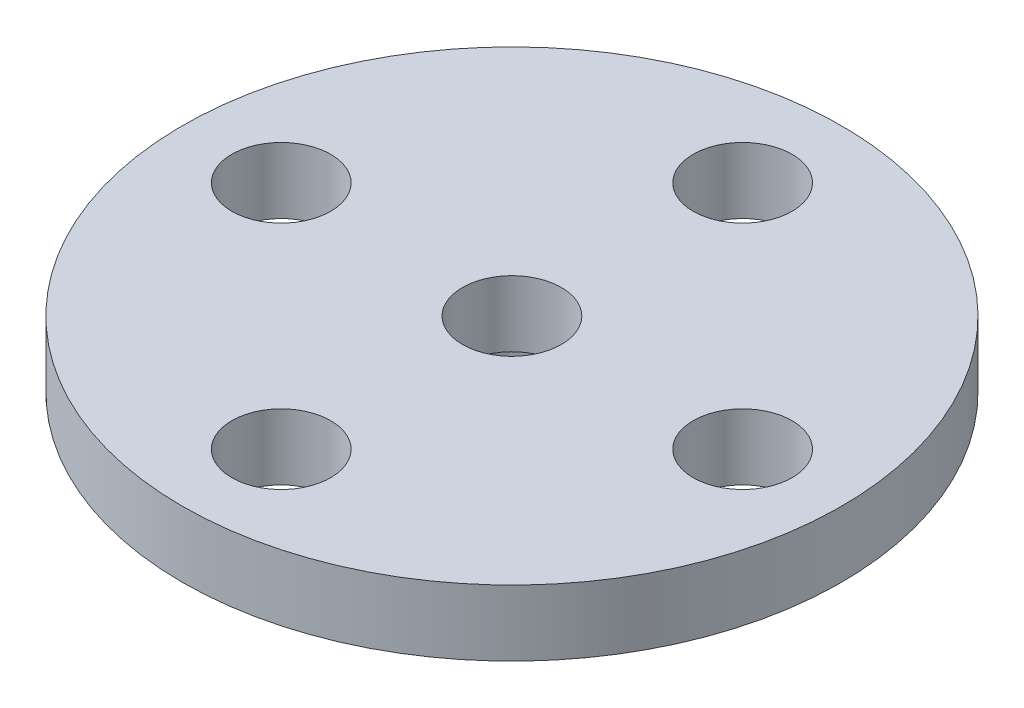
ISO-10303-21;
HEADER;
FILE_DESCRIPTION(('STEP AP214'),'2;1');
FILE_NAME('part.step','',(''),(''),'','','');
FILE_SCHEMA(('AUTOMOTIVE_DESIGN { 1 0 10303 214 1 1 1 1 }'));
ENDSEC;
DATA;
#1=APPLICATION_CONTEXT('core data for automotive mechanical design processes');
#2=APPLICATION_PROTOCOL_DEFINITION('international standard','automotive_design',2000,#1);
#3=PRODUCT_CONTEXT('',#1,'mechanical');
#4=PRODUCT('Part','Part','',(#3));
#5=PRODUCT_RELATED_PRODUCT_CATEGORY('part','',(#4));
#6=PRODUCT_DEFINITION_FORMATION('','',#4);
#7=PRODUCT_DEFINITION_CONTEXT('part definition',#1,'design');
#8=PRODUCT_DEFINITION('design','',#6,#7);
#9=PRODUCT_DEFINITION_SHAPE('','',#8);
#10=(LENGTH_UNIT() NAMED_UNIT(*) SI_UNIT(.MILLI.,.METRE.));
#11=(NAMED_UNIT(*) PLANE_ANGLE_UNIT() SI_UNIT($,.RADIAN.));
#12=(NAMED_UNIT(*) SI_UNIT($,.STERADIAN.) SOLID_ANGLE_UNIT());
#13=UNCERTAINTY_MEASURE_WITH_UNIT(LENGTH_MEASURE(1.E-05),#10,'distance_accuracy_value','');
#14=(GEOMETRIC_REPRESENTATION_CONTEXT(3) GLOBAL_UNCERTAINTY_ASSIGNED_CONTEXT((#13)) GLOBAL_UNIT_ASSIGNED_CONTEXT((#10,
#11,#12)) REPRESENTATION_CONTEXT('',''));
#15=CARTESIAN_POINT('',(0.,0.,0.));
#16=DIRECTION('',(0.,0.,1.));
#17=DIRECTION('',(1.,0.,0.));
#18=AXIS2_PLACEMENT_3D('',#15,#16,#17);
#19=CARTESIAN_POINT('',(0.,0.,0.));
#20=DIRECTION('',(0.,1.,0.));
#21=DIRECTION('',(0.,0.,1.));
#22=AXIS2_PLACEMENT_3D('',#19,#20,#21);
#23=PLANE('',#22);
#24=CARTESIAN_POINT('',(0.,0.,0.));
#25=DIRECTION('',(0.,1.,0.));
#26=DIRECTION('',(0.,0.,1.));
#27=AXIS2_PLACEMENT_3D('',#24,#25,#26);
#28=CIRCLE('',#27,1.5);
#29=CARTESIAN_POINT('',(0.,0.,1.5));
#30=VERTEX_POINT('',#29);
#31=EDGE_CURVE('E59',#30,#30,#28,.T.);
#32=ORIENTED_EDGE('',*,*,#31,.T.);
#33=EDGE_LOOP('',(#32));
#34=FACE_BOUND('',#33,.T.);
#35=CARTESIAN_POINT('',(0.,0.,0.));
#36=DIRECTION('',(0.,-1.,0.));
#37=DIRECTION('',(0.,0.,-1.));
#38=AXIS2_PLACEMENT_3D('',#35,#36,#37);
#39=CIRCLE('',#38,2.07281324157104);
#40=CARTESIAN_POINT('',(0.,0.,-2.07281324157104));
#41=VERTEX_POINT('',#40);
#42=EDGE_CURVE('E86',#41,#41,#39,.T.);
#43=ORIENTED_EDGE('',*,*,#42,.T.);
#44=EDGE_LOOP('',(#43));
#45=FACE_BOUND('',#44,.T.);
#46=ADVANCED_FACE('F35',(#34,#45),#23,.F.);
#47=CARTESIAN_POINT('',(0.,2.,0.));
#48=DIRECTION('',(0.,1.,0.));
#49=DIRECTION('',(0.,0.,1.));
#50=AXIS2_PLACEMENT_3D('',#47,#48,#49);
#51=PLANE('',#50);
#52=CARTESIAN_POINT('',(4.58037733640242E-13,2.,7.));
#53=DIRECTION('',(0.,1.,0.));
#54=DIRECTION('',(0.,0.,1.));
#55=AXIS2_PLACEMENT_3D('',#52,#53,#54);
#56=CIRCLE('',#55,1.5);
#57=CARTESIAN_POINT('',(4.58037733640242E-13,2.,8.5));
#58=VERTEX_POINT('',#57);
#59=EDGE_CURVE('E68',#58,#58,#56,.T.);
#60=ORIENTED_EDGE('',*,*,#59,.F.);
#61=EDGE_LOOP('',(#60));
#62=FACE_BOUND('',#61,.T.);
#63=CARTESIAN_POINT('',(0.,2.,0.));
#64=DIRECTION('',(0.,1.,0.));
#65=DIRECTION('',(0.,0.,1.));
#66=AXIS2_PLACEMENT_3D('',#63,#64,#65);
#67=CIRCLE('',#66,1.5);
#68=CARTESIAN_POINT('',(0.,2.,1.5));
#69=VERTEX_POINT('',#68);
#70=EDGE_CURVE('E56',#69,#69,#67,.T.);
#71=ORIENTED_EDGE('',*,*,#70,.F.);
#72=EDGE_LOOP('',(#71));
#73=FACE_BOUND('',#72,.T.);
#74=CARTESIAN_POINT('',(0.,2.,0.));
#75=DIRECTION('',(0.,1.,0.));
#76=DIRECTION('',(0.,0.,1.));
#77=AXIS2_PLACEMENT_3D('',#74,#75,#76);
#78=CIRCLE('',#77,10.);
#79=CARTESIAN_POINT('',(0.,2.,10.));
#80=VERTEX_POINT('',#79);
#81=EDGE_CURVE('E42',#80,#80,#78,.T.);
#82=ORIENTED_EDGE('',*,*,#81,.T.);
#83=EDGE_LOOP('',(#82));
#84=FACE_BOUND('',#83,.T.);
#85=CARTESIAN_POINT('',(0.,2.,-7.));
#86=DIRECTION('',(0.,1.,0.));
#87=DIRECTION('',(0.,0.,1.));
#88=AXIS2_PLACEMENT_3D('',#85,#86,#87);
#89=CIRCLE('',#88,1.5);
#90=CARTESIAN_POINT('',(0.,2.,-5.5));
#91=VERTEX_POINT('',#90);
#92=EDGE_CURVE('E51',#91,#91,#89,.T.);
#93=ORIENTED_EDGE('',*,*,#92,.F.);
#94=EDGE_LOOP('',(#93));
#95=FACE_BOUND('',#94,.T.);
#96=CARTESIAN_POINT('',(7.00000000000023,2.,-2.28682088950355E-13));
#97=DIRECTION('',(0.,1.,0.));
#98=DIRECTION('',(0.,0.,1.));
#99=AXIS2_PLACEMENT_3D('',#96,#97,#98);
#100=CIRCLE('',#99,1.5);
#101=CARTESIAN_POINT('',(7.00000000000023,2.,1.49999999999977));
#102=VERTEX_POINT('',#101);
#103=EDGE_CURVE('E62',#102,#102,#100,.T.);
#104=ORIENTED_EDGE('',*,*,#103,.F.);
#105=EDGE_LOOP('',(#104));
#106=FACE_BOUND('',#105,.T.);
#107=CARTESIAN_POINT('',(-6.99999999999977,2.,2.29539341709758E-13));
#108=DIRECTION('',(0.,1.,0.));
#109=DIRECTION('',(0.,0.,1.));
#110=AXIS2_PLACEMENT_3D('',#107,#108,#109);
#111=CIRCLE('',#110,1.5);
#112=CARTESIAN_POINT('',(-6.99999999999977,2.,1.50000000000023));
#113=VERTEX_POINT('',#112);
#114=EDGE_CURVE('E74',#113,#113,#111,.T.);
#115=ORIENTED_EDGE('',*,*,#114,.F.);
#116=EDGE_LOOP('',(#115));
#117=FACE_BOUND('',#116,.T.);
#118=ADVANCED_FACE('F112',(#62,#73,#84,#95,#106,#117),#51,.T.);
#119=CARTESIAN_POINT('',(0.,0.,0.));
#120=DIRECTION('',(0.,1.,0.));
#121=DIRECTION('',(0.,0.,1.));
#122=AXIS2_PLACEMENT_3D('',#119,#120,#121);
#123=CIRCLE('',#122,3.20316525601006);
#124=CARTESIAN_POINT('',(0.,0.,3.20316525601006));
#125=VERTEX_POINT('',#124);
#126=EDGE_CURVE('E10',#125,#125,#123,.F.);
#127=ORIENTED_EDGE('',*,*,#126,.F.);
#128=EDGE_LOOP('',(#127));
#129=FACE_BOUND('',#128,.T.);
#130=CARTESIAN_POINT('',(0.,0.,0.));
#131=DIRECTION('',(0.,1.,0.));
#132=DIRECTION('',(0.,0.,1.));
#133=AXIS2_PLACEMENT_3D('',#130,#131,#132);
#134=CIRCLE('',#133,10.);
#135=CARTESIAN_POINT('',(0.,0.,10.));
#136=VERTEX_POINT('',#135);
#137=EDGE_CURVE('E46',#136,#136,#134,.T.);
#138=ORIENTED_EDGE('',*,*,#137,.F.);
#139=EDGE_LOOP('',(#138));
#140=FACE_BOUND('',#139,.T.);
#141=CARTESIAN_POINT('',(0.,0.,-7.));
#142=DIRECTION('',(0.,1.,0.));
#143=DIRECTION('',(0.,0.,1.));
#144=AXIS2_PLACEMENT_3D('',#141,#142,#143);
#145=CIRCLE('',#144,1.5);
#146=CARTESIAN_POINT('',(0.,0.,-5.5));
#147=VERTEX_POINT('',#146);
#148=EDGE_CURVE('E53',#147,#147,#145,.T.);
#149=ORIENTED_EDGE('',*,*,#148,.T.);
#150=EDGE_LOOP('',(#149));
#151=FACE_BOUND('',#150,.T.);
#152=CARTESIAN_POINT('',(7.00000000000023,0.,-2.28682088950355E-13));
#153=DIRECTION('',(0.,1.,0.));
#154=DIRECTION('',(0.,0.,1.));
#155=AXIS2_PLACEMENT_3D('',#152,#153,#154);
#156=CIRCLE('',#155,1.5);
#157=CARTESIAN_POINT('',(7.00000000000023,0.,1.49999999999977));
#158=VERTEX_POINT('',#157);
#159=EDGE_CURVE('E65',#158,#158,#156,.T.);
#160=ORIENTED_EDGE('',*,*,#159,.T.);
#161=EDGE_LOOP('',(#160));
#162=FACE_BOUND('',#161,.T.);
#163=CARTESIAN_POINT('',(4.58037733640242E-13,0.,7.));
#164=DIRECTION('',(0.,1.,0.));
#165=DIRECTION('',(0.,0.,1.));
#166=AXIS2_PLACEMENT_3D('',#163,#164,#165);
#167=CIRCLE('',#166,1.5);
#168=CARTESIAN_POINT('',(4.58037733640242E-13,0.,8.5));
#169=VERTEX_POINT('',#168);
#170=EDGE_CURVE('E71',#169,#169,#167,.T.);
#171=ORIENTED_EDGE('',*,*,#170,.T.);
#172=EDGE_LOOP('',(#171));
#173=FACE_BOUND('',#172,.T.);
#174=CARTESIAN_POINT('',(-6.99999999999977,0.,2.29539341709758E-13));
#175=DIRECTION('',(0.,1.,0.));
#176=DIRECTION('',(0.,0.,1.));
#177=AXIS2_PLACEMENT_3D('',#174,#175,#176);
#178=CIRCLE('',#177,1.5);
#179=CARTESIAN_POINT('',(-6.99999999999977,0.,1.50000000000023));
#180=VERTEX_POINT('',#179);
#181=EDGE_CURVE('E77',#180,#180,#178,.T.);
#182=ORIENTED_EDGE('',*,*,#181,.T.);
#183=EDGE_LOOP('',(#182));
#184=FACE_BOUND('',#183,.T.);
#185=ADVANCED_FACE('F114',(#129,#140,#151,#162,#173,#184),#23,.F.);
#186=CARTESIAN_POINT('',(0.,2.,0.));
#187=DIRECTION('',(0.,-1.,0.));
#188=DIRECTION('',(0.,0.,-1.));
#189=AXIS2_PLACEMENT_3D('',#186,#187,#188);
#190=CYLINDRICAL_SURFACE('',#189,10.);
#191=ORIENTED_EDGE('',*,*,#81,.F.);
#192=EDGE_LOOP('',(#191));
#193=FACE_BOUND('',#192,.T.);
#194=ORIENTED_EDGE('',*,*,#137,.T.);
#195=EDGE_LOOP('',(#194));
#196=FACE_BOUND('',#195,.T.);
#197=ADVANCED_FACE('F37',(#193,#196),#190,.T.);
#198=CARTESIAN_POINT('',(0.,2.,-7.));
#199=DIRECTION('',(0.,-1.,0.));
#200=DIRECTION('',(0.,0.,-1.));
#201=AXIS2_PLACEMENT_3D('',#198,#199,#200);
#202=CYLINDRICAL_SURFACE('',#201,1.5);
#203=ORIENTED_EDGE('',*,*,#92,.T.);
#204=EDGE_LOOP('',(#203));
#205=FACE_BOUND('',#204,.T.);
#206=ORIENTED_EDGE('',*,*,#148,.F.);
#207=EDGE_LOOP('',(#206));
#208=FACE_BOUND('',#207,.T.);
#209=ADVANCED_FACE('F126',(#205,#208),#202,.F.);
#210=CARTESIAN_POINT('',(0.,2.,0.));
#211=DIRECTION('',(0.,-1.,0.));
#212=DIRECTION('',(0.,0.,-1.));
#213=AXIS2_PLACEMENT_3D('',#210,#211,#212);
#214=CYLINDRICAL_SURFACE('',#213,1.5);
#215=ORIENTED_EDGE('',*,*,#70,.T.);
#216=EDGE_LOOP('',(#215));
#217=FACE_BOUND('',#216,.T.);
#218=ORIENTED_EDGE('',*,*,#31,.F.);
#219=EDGE_LOOP('',(#218));
#220=FACE_BOUND('',#219,.T.);
#221=ADVANCED_FACE('F147',(#217,#220),#214,.F.);
#222=CARTESIAN_POINT('',(7.00000000000023,2.,-2.28682088950355E-13));
#223=DIRECTION('',(0.,-1.,0.));
#224=DIRECTION('',(0.,0.,-1.));
#225=AXIS2_PLACEMENT_3D('',#222,#223,#224);
#226=CYLINDRICAL_SURFACE('',#225,1.5);
#227=ORIENTED_EDGE('',*,*,#103,.T.);
#228=EDGE_LOOP('',(#227));
#229=FACE_BOUND('',#228,.T.);
#230=ORIENTED_EDGE('',*,*,#159,.F.);
#231=EDGE_LOOP('',(#230));
#232=FACE_BOUND('',#231,.T.);
#233=ADVANCED_FACE('F141',(#229,#232),#226,.F.);
#234=CARTESIAN_POINT('',(4.58037733640242E-13,2.,7.));
#235=DIRECTION('',(0.,-1.,0.));
#236=DIRECTION('',(0.,0.,-1.));
#237=AXIS2_PLACEMENT_3D('',#234,#235,#236);
#238=CYLINDRICAL_SURFACE('',#237,1.5);
#239=ORIENTED_EDGE('',*,*,#59,.T.);
#240=EDGE_LOOP('',(#239));
#241=FACE_BOUND('',#240,.T.);
#242=ORIENTED_EDGE('',*,*,#170,.F.);
#243=EDGE_LOOP('',(#242));
#244=FACE_BOUND('',#243,.T.);
#245=ADVANCED_FACE('F107',(#241,#244),#238,.F.);
#246=CARTESIAN_POINT('',(-6.99999999999977,2.,2.29539341709758E-13));
#247=DIRECTION('',(0.,-1.,0.));
#248=DIRECTION('',(0.,0.,-1.));
#249=AXIS2_PLACEMENT_3D('',#246,#247,#248);
#250=CYLINDRICAL_SURFACE('',#249,1.5);
#251=ORIENTED_EDGE('',*,*,#114,.T.);
#252=EDGE_LOOP('',(#251));
#253=FACE_BOUND('',#252,.T.);
#254=ORIENTED_EDGE('',*,*,#181,.F.);
#255=EDGE_LOOP('',(#254));
#256=FACE_BOUND('',#255,.T.);
#257=ADVANCED_FACE('F98',(#253,#256),#250,.F.);
#258=CARTESIAN_POINT('',(0.,-2.5,0.));
#259=DIRECTION('',(0.,-1.,0.));
#260=DIRECTION('',(0.,0.,-1.));
#261=AXIS2_PLACEMENT_3D('',#258,#259,#260);
#262=PLANE('',#261);
#263=CARTESIAN_POINT('',(0.,-2.5,0.));
#264=DIRECTION('',(0.,-1.,0.));
#265=DIRECTION('',(0.,0.,-1.));
#266=AXIS2_PLACEMENT_3D('',#263,#264,#265);
#267=CIRCLE('',#266,3.20316525601006);
#268=CARTESIAN_POINT('',(0.,-2.5,-3.20316525601006));
#269=VERTEX_POINT('',#268);
#270=EDGE_CURVE('E80',#269,#269,#267,.T.);
#271=ORIENTED_EDGE('',*,*,#270,.T.);
#272=EDGE_LOOP('',(#271));
#273=FACE_BOUND('',#272,.T.);
#274=CARTESIAN_POINT('',(0.,-2.5,0.));
#275=DIRECTION('',(0.,-1.,0.));
#276=DIRECTION('',(0.,0.,-1.));
#277=AXIS2_PLACEMENT_3D('',#274,#275,#276);
#278=CIRCLE('',#277,2.07281324157104);
#279=CARTESIAN_POINT('',(0.,-2.5,-2.07281324157104));
#280=VERTEX_POINT('',#279);
#281=EDGE_CURVE('E85',#280,#280,#278,.T.);
#282=ORIENTED_EDGE('',*,*,#281,.F.);
#283=EDGE_LOOP('',(#282));
#284=FACE_BOUND('',#283,.T.);
#285=ADVANCED_FACE('F95',(#273,#284),#262,.T.);
#286=CARTESIAN_POINT('',(0.,-2.5,0.));
#287=DIRECTION('',(0.,1.,0.));
#288=DIRECTION('',(0.,0.,1.));
#289=AXIS2_PLACEMENT_3D('',#286,#287,#288);
#290=CYLINDRICAL_SURFACE('',#289,3.20316525601006);
#291=ORIENTED_EDGE('',*,*,#270,.F.);
#292=EDGE_LOOP('',(#291));
#293=FACE_BOUND('',#292,.T.);
#294=ORIENTED_EDGE('',*,*,#126,.T.);
#295=EDGE_LOOP('',(#294));
#296=FACE_BOUND('',#295,.T.);
#297=ADVANCED_FACE('F97',(#293,#296),#290,.T.);
#298=CARTESIAN_POINT('',(0.,-2.5,0.));
#299=DIRECTION('',(0.,1.,0.));
#300=DIRECTION('',(0.,0.,1.));
#301=AXIS2_PLACEMENT_3D('',#298,#299,#300);
#302=CYLINDRICAL_SURFACE('',#301,2.07281324157104);
#303=ORIENTED_EDGE('',*,*,#281,.T.);
#304=EDGE_LOOP('',(#303));
#305=FACE_BOUND('',#304,.T.);
#306=ORIENTED_EDGE('',*,*,#42,.F.);
#307=EDGE_LOOP('',(#306));
#308=FACE_BOUND('',#307,.T.);
#309=ADVANCED_FACE('F92',(#305,#308),#302,.F.);
#310=CLOSED_SHELL('',(#46,#118,#185,#197,#209,#221,#233,#245,#257,#285,#297,#309));
#311=MANIFOLD_SOLID_BREP('B2',#310);
#312=ADVANCED_BREP_SHAPE_REPRESENTATION('',(#18,#311),#14);
#313=SHAPE_DEFINITION_REPRESENTATION(#9,#312);
ENDSEC;
END-ISO-10303-21;
